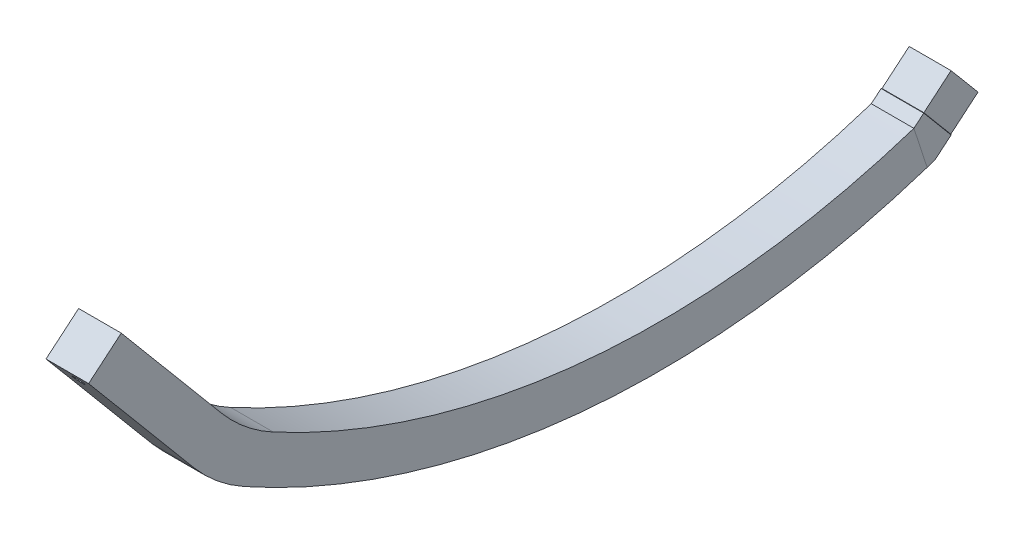
ISO-10303-21;
HEADER;
FILE_DESCRIPTION(('STEP AP214'),'2;1');
FILE_NAME('part.step','',(''),(''),'','','');
FILE_SCHEMA(('AUTOMOTIVE_DESIGN { 1 0 10303 214 1 1 1 1 }'));
ENDSEC;
DATA;
#1=APPLICATION_CONTEXT('core data for automotive mechanical design processes');
#2=APPLICATION_PROTOCOL_DEFINITION('international standard','automotive_design',2000,#1);
#3=PRODUCT_CONTEXT('',#1,'mechanical');
#4=PRODUCT('Part','Part','',(#3));
#5=PRODUCT_RELATED_PRODUCT_CATEGORY('part','',(#4));
#6=PRODUCT_DEFINITION_FORMATION('','',#4);
#7=PRODUCT_DEFINITION_CONTEXT('part definition',#1,'design');
#8=PRODUCT_DEFINITION('design','',#6,#7);
#9=PRODUCT_DEFINITION_SHAPE('','',#8);
#10=(LENGTH_UNIT() NAMED_UNIT(*) SI_UNIT(.MILLI.,.METRE.));
#11=(NAMED_UNIT(*) PLANE_ANGLE_UNIT() SI_UNIT($,.RADIAN.));
#12=(NAMED_UNIT(*) SI_UNIT($,.STERADIAN.) SOLID_ANGLE_UNIT());
#13=UNCERTAINTY_MEASURE_WITH_UNIT(LENGTH_MEASURE(1.E-05),#10,'distance_accuracy_value','');
#14=(GEOMETRIC_REPRESENTATION_CONTEXT(3) GLOBAL_UNCERTAINTY_ASSIGNED_CONTEXT((#13)) GLOBAL_UNIT_ASSIGNED_CONTEXT((#10,
#11,#12)) REPRESENTATION_CONTEXT('',''));
#15=CARTESIAN_POINT('',(0.,0.,0.));
#16=DIRECTION('',(0.,0.,1.));
#17=DIRECTION('',(1.,0.,0.));
#18=AXIS2_PLACEMENT_3D('',#15,#16,#17);
#19=CARTESIAN_POINT('',(12.,23.0257511275811,-14.4824825913771));
#20=DIRECTION('',(0.,0.766044443118982,0.642787609686534));
#21=DIRECTION('',(0.,-0.642787609686534,0.766044443118982));
#22=AXIS2_PLACEMENT_3D('',#19,#20,#21);
#23=PLANE('',#22);
#24=DIRECTION('',(0.,0.642787609686534,-0.766044443118982));
#25=VECTOR('',#24,1.);
#26=CARTESIAN_POINT('',(0.,23.0257511275811,-14.4824825913771));
#27=LINE('',#26,#25);
#28=CARTESIAN_POINT('',(0.,12.7411493725965,-2.22577150147341));
#29=VERTEX_POINT('',#28);
#30=CARTESIAN_POINT('',(0.,16.5335962697471,-6.7454337158754));
#31=VERTEX_POINT('',#30);
#32=EDGE_CURVE('E190',#29,#31,#27,.T.);
#33=ORIENTED_EDGE('',*,*,#32,.T.);
#34=DIRECTION('',(1.,0.,0.));
#35=VECTOR('',#34,1.);
#36=CARTESIAN_POINT('',(12.,16.5335962697471,-6.7454337158754));
#37=LINE('',#36,#35);
#38=CARTESIAN_POINT('',(12.,16.533596269747,-6.74543371587538));
#39=VERTEX_POINT('',#38);
#40=EDGE_CURVE('E69',#31,#39,#37,.T.);
#41=ORIENTED_EDGE('',*,*,#40,.T.);
#42=DIRECTION('',(0.,0.642787609686534,-0.766044443118982));
#43=VECTOR('',#42,1.);
#44=CARTESIAN_POINT('',(12.,23.0257511275811,-14.4824825913771));
#45=LINE('',#44,#43);
#46=CARTESIAN_POINT('',(12.,12.7411493725965,-2.22577150147341));
#47=VERTEX_POINT('',#46);
#48=EDGE_CURVE('E181',#47,#39,#45,.T.);
#49=ORIENTED_EDGE('',*,*,#48,.F.);
#50=DIRECTION('',(-1.,0.,0.));
#51=VECTOR('',#50,1.);
#52=CARTESIAN_POINT('',(12.,12.7411493725965,-2.22577150147341));
#53=LINE('',#52,#51);
#54=EDGE_CURVE('E195',#47,#29,#53,.T.);
#55=ORIENTED_EDGE('',*,*,#54,.T.);
#56=EDGE_LOOP('',(#33,#41,#49,#55));
#57=FACE_BOUND('',#56,.T.);
#58=ADVANCED_FACE('F45',(#57),#23,.F.);
#59=CARTESIAN_POINT('',(12.,23.403668611832,3.73581881138778));
#60=DIRECTION('',(0.,-0.766044443118981,-0.642787609686535));
#61=DIRECTION('',(0.,0.642787609686535,-0.766044443118982));
#62=AXIS2_PLACEMENT_3D('',#59,#60,#61);
#63=PLANE('',#62);
#64=DIRECTION('',(0.,-0.642787609686535,0.766044443118982));
#65=VECTOR('',#64,1.);
#66=CARTESIAN_POINT('',(12.,23.403668611832,3.73581881138778));
#67=LINE('',#66,#65);
#68=CARTESIAN_POINT('',(12.,25.7261295871748,0.968017600363012));
#69=VERTEX_POINT('',#68);
#70=CARTESIAN_POINT('',(12.,23.403668611832,3.73581881138778));
#71=VERTEX_POINT('',#70);
#72=EDGE_CURVE('E183',#69,#71,#67,.T.);
#73=ORIENTED_EDGE('',*,*,#72,.F.);
#74=DIRECTION('',(-1.,0.,0.));
#75=VECTOR('',#74,1.);
#76=CARTESIAN_POINT('',(0.,25.7261295871748,0.968017600363013));
#77=LINE('',#76,#75);
#78=CARTESIAN_POINT('',(0.,25.7261295871748,0.968017600363012));
#79=VERTEX_POINT('',#78);
#80=EDGE_CURVE('E12',#69,#79,#77,.T.);
#81=ORIENTED_EDGE('',*,*,#80,.T.);
#82=DIRECTION('',(0.,-0.642787609686535,0.766044443118982));
#83=VECTOR('',#82,1.);
#84=CARTESIAN_POINT('',(0.,23.403668611832,3.73581881138778));
#85=LINE('',#84,#83);
#86=CARTESIAN_POINT('',(0.,23.403668611832,3.73581881138778));
#87=VERTEX_POINT('',#86);
#88=EDGE_CURVE('E179',#79,#87,#85,.T.);
#89=ORIENTED_EDGE('',*,*,#88,.T.);
#90=DIRECTION('',(-1.,0.,0.));
#91=VECTOR('',#90,1.);
#92=CARTESIAN_POINT('',(12.,23.403668611832,3.73581881138778));
#93=LINE('',#92,#91);
#94=EDGE_CURVE('E185',#71,#87,#93,.T.);
#95=ORIENTED_EDGE('',*,*,#94,.F.);
#96=EDGE_LOOP('',(#73,#81,#89,#95));
#97=FACE_BOUND('',#96,.T.);
#98=ADVANCED_FACE('F213',(#97),#63,.F.);
#99=CARTESIAN_POINT('',(12.,241.476472406345,75.1760290102655));
#100=DIRECTION('',(1.,0.,0.));
#101=DIRECTION('',(0.,0.,-1.));
#102=AXIS2_PLACEMENT_3D('',#99,#100,#101);
#103=PLANE('',#102);
#104=ORIENTED_EDGE('',*,*,#48,.T.);
#105=DIRECTION('',(0.,0.766044443118981,0.642787609686535));
#106=VECTOR('',#105,1.);
#107=CARTESIAN_POINT('',(12.,188.873940413588,137.865285492186));
#108=LINE('',#107,#106);
#109=EDGE_CURVE('E54',#39,#69,#108,.T.);
#110=ORIENTED_EDGE('',*,*,#109,.T.);
#111=ORIENTED_EDGE('',*,*,#72,.T.);
#112=DIRECTION('',(0.,-0.950305717652662,-0.311318234282315));
#113=VECTOR('',#112,1.);
#114=CARTESIAN_POINT('',(12.,23.403668611832,3.73581881138778));
#115=LINE('',#114,#113);
#116=CARTESIAN_POINT('',(12.,12.,1.52655665885959E-13));
#117=VERTEX_POINT('',#116);
#118=EDGE_CURVE('E175',#71,#117,#115,.T.);
#119=ORIENTED_EDGE('',*,*,#118,.T.);
#120=CARTESIAN_POINT('',(12.,241.476472406345,75.1760290102655));
#121=DIRECTION('',(1.,0.,0.));
#122=DIRECTION('',(0.,0.,-1.));
#123=AXIS2_PLACEMENT_3D('',#120,#121,#122);
#124=CIRCLE('',#123,241.476472406345);
#125=EDGE_CURVE('E178',#117,#47,#124,.T.);
#126=ORIENTED_EDGE('',*,*,#125,.T.);
#127=EDGE_LOOP('',(#104,#110,#111,#119,#126));
#128=FACE_BOUND('',#127,.T.);
#129=ADVANCED_FACE('F223',(#128),#103,.T.);
#130=CARTESIAN_POINT('',(0.,241.476472406345,75.1760290102655));
#131=DIRECTION('',(1.,0.,0.));
#132=DIRECTION('',(0.,0.,-1.));
#133=AXIS2_PLACEMENT_3D('',#130,#131,#132);
#134=PLANE('',#133);
#135=ORIENTED_EDGE('',*,*,#88,.F.);
#136=DIRECTION('',(0.,-0.766044443118981,-0.642787609686535));
#137=VECTOR('',#136,1.);
#138=CARTESIAN_POINT('',(0.,16.5335962697471,-6.74543371587538));
#139=LINE('',#138,#137);
#140=EDGE_CURVE('E125',#79,#31,#139,.T.);
#141=ORIENTED_EDGE('',*,*,#140,.T.);
#142=ORIENTED_EDGE('',*,*,#32,.F.);
#143=CARTESIAN_POINT('',(0.,241.476472406345,75.1760290102655));
#144=DIRECTION('',(1.,0.,0.));
#145=DIRECTION('',(0.,0.,-1.));
#146=AXIS2_PLACEMENT_3D('',#143,#144,#145);
#147=CIRCLE('',#146,241.476472406345);
#148=CARTESIAN_POINT('',(0.,12.,1.52655665885959E-13));
#149=VERTEX_POINT('',#148);
#150=EDGE_CURVE('E188',#149,#29,#147,.T.);
#151=ORIENTED_EDGE('',*,*,#150,.F.);
#152=DIRECTION('',(0.,-0.950305717652662,-0.311318234282315));
#153=VECTOR('',#152,1.);
#154=CARTESIAN_POINT('',(0.,23.403668611832,3.73581881138778));
#155=LINE('',#154,#153);
#156=EDGE_CURVE('E171',#87,#149,#155,.T.);
#157=ORIENTED_EDGE('',*,*,#156,.F.);
#158=EDGE_LOOP('',(#135,#141,#142,#151,#157));
#159=FACE_BOUND('',#158,.T.);
#160=ADVANCED_FACE('F217',(#159),#134,.F.);
#161=CARTESIAN_POINT('',(12.,23.403668611832,3.73581881138778));
#162=DIRECTION('',(0.,0.311318234282315,-0.950305717652662));
#163=DIRECTION('',(0.,0.950305717652662,0.311318234282315));
#164=AXIS2_PLACEMENT_3D('',#161,#162,#163);
#165=PLANE('',#164);
#166=ORIENTED_EDGE('',*,*,#156,.T.);
#167=DIRECTION('',(-1.,0.,0.));
#168=VECTOR('',#167,1.);
#169=CARTESIAN_POINT('',(12.,12.,1.52655665885959E-13));
#170=LINE('',#169,#168);
#171=EDGE_CURVE('E198',#117,#149,#170,.T.);
#172=ORIENTED_EDGE('',*,*,#171,.F.);
#173=ORIENTED_EDGE('',*,*,#118,.F.);
#174=ORIENTED_EDGE('',*,*,#94,.T.);
#175=EDGE_LOOP('',(#166,#172,#173,#174));
#176=FACE_BOUND('',#175,.T.);
#177=ADVANCED_FACE('F221',(#176),#165,.F.);
#178=CARTESIAN_POINT('',(12.,241.476472406345,75.1760290102655));
#179=DIRECTION('',(-1.,0.,0.));
#180=DIRECTION('',(0.,0.,1.));
#181=AXIS2_PLACEMENT_3D('',#178,#179,#180);
#182=CYLINDRICAL_SURFACE('',#181,241.476472406345);
#183=ORIENTED_EDGE('',*,*,#150,.T.);
#184=ORIENTED_EDGE('',*,*,#54,.F.);
#185=ORIENTED_EDGE('',*,*,#125,.F.);
#186=ORIENTED_EDGE('',*,*,#171,.T.);
#187=EDGE_LOOP('',(#183,#184,#185,#186));
#188=FACE_BOUND('',#187,.T.);
#189=ADVANCED_FACE('F226',(#188),#182,.T.);
#190=CARTESIAN_POINT('',(0.1,16.6744794750276,-6.75775939921866));
#191=DIRECTION('',(-1.,0.,0.));
#192=DIRECTION('',(0.,0.,1.));
#193=AXIS2_PLACEMENT_3D('',#190,#191,#192);
#194=PLANE('',#193);
#195=DIRECTION('',(0.,0.766044443118982,0.642787609686535));
#196=VECTOR('',#195,1.);
#197=CARTESIAN_POINT('',(0.1,23.102355571893,-14.4182038304085));
#198=LINE('',#197,#196);
#199=CARTESIAN_POINT('',(0.1,23.102355571893,-14.4182038304085));
#200=VERTEX_POINT('',#199);
#201=CARTESIAN_POINT('',(0.1,32.141680000697,-6.83331003610735));
#202=VERTEX_POINT('',#201);
#203=EDGE_CURVE('E165',#200,#202,#198,.T.);
#204=ORIENTED_EDGE('',*,*,#203,.F.);
#205=DIRECTION('',(0.,0.642787609686535,-0.766044443118981));
#206=VECTOR('',#205,1.);
#207=CARTESIAN_POINT('',(0.1,16.6744794750276,-6.75775939921866));
#208=LINE('',#207,#206);
#209=CARTESIAN_POINT('',(0.1,16.6744794750276,-6.75775939921866));
#210=VERTEX_POINT('',#209);
#211=EDGE_CURVE('E154',#210,#200,#208,.T.);
#212=ORIENTED_EDGE('',*,*,#211,.F.);
#213=DIRECTION('',(0.,0.766044443118982,0.642787609686535));
#214=VECTOR('',#213,1.);
#215=CARTESIAN_POINT('',(0.1,16.6744794750276,-6.75775939921866));
#216=LINE('',#215,#214);
#217=CARTESIAN_POINT('',(0.1,25.7138039038316,0.827134395082459));
#218=VERTEX_POINT('',#217);
#219=EDGE_CURVE('E123',#210,#218,#216,.T.);
#220=ORIENTED_EDGE('',*,*,#219,.T.);
#221=DIRECTION('',(0.,0.642787609686535,-0.766044443118981));
#222=VECTOR('',#221,1.);
#223=CARTESIAN_POINT('',(0.1,25.7138039038316,0.827134395082459));
#224=LINE('',#223,#222);
#225=EDGE_CURVE('E143',#218,#202,#224,.T.);
#226=ORIENTED_EDGE('',*,*,#225,.T.);
#227=EDGE_LOOP('',(#204,#212,#220,#226));
#228=FACE_BOUND('',#227,.T.);
#229=ADVANCED_FACE('F153',(#228),#194,.T.);
#230=CARTESIAN_POINT('',(11.9,16.6744794750276,-6.75775939921866));
#231=DIRECTION('',(0.,-0.766044443118981,-0.642787609686535));
#232=DIRECTION('',(0.,0.642787609686535,-0.766044443118981));
#233=AXIS2_PLACEMENT_3D('',#230,#231,#232);
#234=PLANE('',#233);
#235=DIRECTION('',(-1.,0.,0.));
#236=VECTOR('',#235,1.);
#237=CARTESIAN_POINT('',(11.9,23.102355571893,-14.4182038304085));
#238=LINE('',#237,#236);
#239=CARTESIAN_POINT('',(11.9,23.102355571893,-14.4182038304085));
#240=VERTEX_POINT('',#239);
#241=EDGE_CURVE('E156',#240,#200,#238,.T.);
#242=ORIENTED_EDGE('',*,*,#241,.F.);
#243=DIRECTION('',(0.,0.642787609686535,-0.766044443118981));
#244=VECTOR('',#243,1.);
#245=CARTESIAN_POINT('',(11.9,16.6744794750276,-6.75775939921866));
#246=LINE('',#245,#244);
#247=CARTESIAN_POINT('',(11.9,16.6744794750276,-6.75775939921866));
#248=VERTEX_POINT('',#247);
#249=EDGE_CURVE('E172',#248,#240,#246,.T.);
#250=ORIENTED_EDGE('',*,*,#249,.F.);
#251=DIRECTION('',(-1.,0.,0.));
#252=VECTOR('',#251,1.);
#253=CARTESIAN_POINT('',(11.9,16.6744794750276,-6.75775939921866));
#254=LINE('',#253,#252);
#255=EDGE_CURVE('E151',#248,#210,#254,.T.);
#256=ORIENTED_EDGE('',*,*,#255,.T.);
#257=ORIENTED_EDGE('',*,*,#211,.T.);
#258=EDGE_LOOP('',(#242,#250,#256,#257));
#259=FACE_BOUND('',#258,.T.);
#260=ADVANCED_FACE('F258',(#259),#234,.T.);
#261=CARTESIAN_POINT('',(11.9,16.6744794750276,-6.75775939921866));
#262=DIRECTION('',(1.,0.,0.));
#263=DIRECTION('',(0.,0.,-1.));
#264=AXIS2_PLACEMENT_3D('',#261,#262,#263);
#265=PLANE('',#264);
#266=DIRECTION('',(0.,-0.766044443118982,-0.642787609686535));
#267=VECTOR('',#266,1.);
#268=CARTESIAN_POINT('',(11.9,23.102355571893,-14.4182038304085));
#269=LINE('',#268,#267);
#270=CARTESIAN_POINT('',(11.9,32.141680000697,-6.83331003610735));
#271=VERTEX_POINT('',#270);
#272=EDGE_CURVE('E159',#271,#240,#269,.T.);
#273=ORIENTED_EDGE('',*,*,#272,.F.);
#274=DIRECTION('',(0.,0.642787609686535,-0.766044443118981));
#275=VECTOR('',#274,1.);
#276=CARTESIAN_POINT('',(11.9,25.7138039038316,0.827134395082459));
#277=LINE('',#276,#275);
#278=CARTESIAN_POINT('',(11.9,25.7138039038316,0.82713439508246));
#279=VERTEX_POINT('',#278);
#280=EDGE_CURVE('E150',#279,#271,#277,.T.);
#281=ORIENTED_EDGE('',*,*,#280,.F.);
#282=DIRECTION('',(0.,-0.766044443118982,-0.642787609686535));
#283=VECTOR('',#282,1.);
#284=CARTESIAN_POINT('',(11.9,16.6744794750276,-6.75775939921866));
#285=LINE('',#284,#283);
#286=EDGE_CURVE('E140',#279,#248,#285,.T.);
#287=ORIENTED_EDGE('',*,*,#286,.T.);
#288=ORIENTED_EDGE('',*,*,#249,.T.);
#289=EDGE_LOOP('',(#273,#281,#287,#288));
#290=FACE_BOUND('',#289,.T.);
#291=ADVANCED_FACE('F254',(#290),#265,.T.);
#292=CARTESIAN_POINT('',(11.9,25.7138039038316,0.827134395082459));
#293=DIRECTION('',(0.,0.766044443118981,0.642787609686535));
#294=DIRECTION('',(0.,-0.642787609686535,0.766044443118981));
#295=AXIS2_PLACEMENT_3D('',#292,#293,#294);
#296=PLANE('',#295);
#297=DIRECTION('',(1.,0.,0.));
#298=VECTOR('',#297,1.);
#299=CARTESIAN_POINT('',(11.9,32.141680000697,-6.83331003610736));
#300=LINE('',#299,#298);
#301=EDGE_CURVE('E146',#202,#271,#300,.T.);
#302=ORIENTED_EDGE('',*,*,#301,.F.);
#303=ORIENTED_EDGE('',*,*,#225,.F.);
#304=DIRECTION('',(1.,0.,0.));
#305=VECTOR('',#304,1.);
#306=CARTESIAN_POINT('',(11.9,25.7138039038316,0.827134395082459));
#307=LINE('',#306,#305);
#308=EDGE_CURVE('E132',#218,#279,#307,.T.);
#309=ORIENTED_EDGE('',*,*,#308,.T.);
#310=ORIENTED_EDGE('',*,*,#280,.T.);
#311=EDGE_LOOP('',(#302,#303,#309,#310));
#312=FACE_BOUND('',#311,.T.);
#313=ADVANCED_FACE('F144',(#312),#296,.T.);
#314=CARTESIAN_POINT('',(12.,32.2182844450088,-6.7690312751387));
#315=DIRECTION('',(0.,-0.642787609686535,0.766044443118981));
#316=DIRECTION('',(0.,-0.766044443118981,-0.642787609686535));
#317=AXIS2_PLACEMENT_3D('',#314,#315,#316);
#318=PLANE('',#317);
#319=ORIENTED_EDGE('',*,*,#203,.T.);
#320=ORIENTED_EDGE('',*,*,#301,.T.);
#321=ORIENTED_EDGE('',*,*,#272,.T.);
#322=ORIENTED_EDGE('',*,*,#241,.T.);
#323=EDGE_LOOP('',(#319,#320,#321,#322));
#324=FACE_BOUND('',#323,.T.);
#325=ADVANCED_FACE('F235',(#324),#318,.F.);
#326=CARTESIAN_POINT('',(12.,188.873940413588,137.865285492186));
#327=DIRECTION('',(-0.707106781186633,-0.454519477671986,0.541675220419639));
#328=DIRECTION('',(0.,0.766044443118981,0.642787609686535));
#329=AXIS2_PLACEMENT_3D('',#326,#327,#328);
#330=PLANE('',#329);
#331=DIRECTION('',(0.577350269189527,0.0711623659617004,0.813389564930307));
#332=VECTOR('',#331,1.);
#333=CARTESIAN_POINT('',(9.93333333333398,25.4713987980811,-1.94356864210147));
#334=LINE('',#333,#332);
#335=EDGE_CURVE('E136',#69,#279,#334,.F.);
#336=ORIENTED_EDGE('',*,*,#335,.F.);
#337=ORIENTED_EDGE('',*,*,#109,.F.);
#338=DIRECTION('',(0.577350269189526,-0.81338956493031,0.0711623659616761));
#339=VECTOR('',#338,1.);
#340=CARTESIAN_POINT('',(-62.9914471637958,122.183950720401,-15.9886420278021));
#341=LINE('',#340,#339);
#342=EDGE_CURVE('E49',#248,#39,#341,.T.);
#343=ORIENTED_EDGE('',*,*,#342,.F.);
#344=ORIENTED_EDGE('',*,*,#286,.F.);
#345=EDGE_LOOP('',(#336,#337,#343,#344));
#346=FACE_BOUND('',#345,.T.);
#347=ADVANCED_FACE('F47',(#346),#330,.F.);
#348=CARTESIAN_POINT('',(6.,16.6744794750276,-6.75775939921864));
#349=DIRECTION('',(0.,-0.0871557427476467,-0.996194698091746));
#350=DIRECTION('',(1.,0.,0.));
#351=AXIS2_PLACEMENT_3D('',#348,#349,#350);
#352=PLANE('',#351);
#353=ORIENTED_EDGE('',*,*,#342,.T.);
#354=ORIENTED_EDGE('',*,*,#40,.F.);
#355=DIRECTION('',(0.577350269189529,0.813389564930307,-0.0711623659616759));
#356=VECTOR('',#355,1.);
#357=CARTESIAN_POINT('',(2.06666666666601,19.4451825122116,-7.00016450496905));
#358=LINE('',#357,#356);
#359=EDGE_CURVE('E128',#210,#31,#358,.F.);
#360=ORIENTED_EDGE('',*,*,#359,.F.);
#361=ORIENTED_EDGE('',*,*,#255,.F.);
#362=EDGE_LOOP('',(#353,#354,#360,#361));
#363=FACE_BOUND('',#362,.T.);
#364=ADVANCED_FACE('F208',(#363),#352,.T.);
#365=CARTESIAN_POINT('',(6.,25.7138039038316,0.827134395082455));
#366=DIRECTION('',(0.,0.996194698091744,-0.0871557427476766));
#367=DIRECTION('',(-1.,0.,0.));
#368=AXIS2_PLACEMENT_3D('',#365,#366,#367);
#369=PLANE('',#368);
#370=ORIENTED_EDGE('',*,*,#335,.T.);
#371=ORIENTED_EDGE('',*,*,#308,.F.);
#372=DIRECTION('',(-0.57735026918953,0.0711623659617003,0.813389564930304));
#373=VECTOR('',#372,1.);
#374=CARTESIAN_POINT('',(2.06666666666602,25.4713987980811,-1.94356864210149));
#375=LINE('',#374,#373);
#376=EDGE_CURVE('E119',#79,#218,#375,.F.);
#377=ORIENTED_EDGE('',*,*,#376,.F.);
#378=ORIENTED_EDGE('',*,*,#80,.F.);
#379=EDGE_LOOP('',(#370,#371,#377,#378));
#380=FACE_BOUND('',#379,.T.);
#381=ADVANCED_FACE('F134',(#380),#369,.T.);
#382=CARTESIAN_POINT('',(0.100000000000007,21.1941416894296,-2.9653125020681));
#383=DIRECTION('',(-0.70710678118663,0.454519477671988,-0.541675220419641));
#384=DIRECTION('',(0.,-0.766044443118981,-0.642787609686535));
#385=AXIS2_PLACEMENT_3D('',#382,#383,#384);
#386=PLANE('',#385);
#387=ORIENTED_EDGE('',*,*,#359,.T.);
#388=ORIENTED_EDGE('',*,*,#140,.F.);
#389=ORIENTED_EDGE('',*,*,#376,.T.);
#390=ORIENTED_EDGE('',*,*,#219,.F.);
#391=EDGE_LOOP('',(#387,#388,#389,#390));
#392=FACE_BOUND('',#391,.T.);
#393=ADVANCED_FACE('F121',(#392),#386,.T.);
#394=CLOSED_SHELL('',(#58,#98,#129,#160,#177,#189,#229,#260,#291,#313,#325,#347,#364,#381,#393));
#395=MANIFOLD_SOLID_BREP('B2',#394);
#396=CARTESIAN_POINT('',(12.,241.476472406345,75.1760290102655));
#397=DIRECTION('',(-1.,0.,0.));
#398=DIRECTION('',(0.,0.,1.));
#399=AXIS2_PLACEMENT_3D('',#396,#397,#398);
#400=CYLINDRICAL_SURFACE('',#399,241.476472406345);
#401=CARTESIAN_POINT('',(12.,241.476472406345,75.1760290102655));
#402=DIRECTION('',(1.,0.,0.));
#403=DIRECTION('',(0.,0.,1.));
#404=AXIS2_PLACEMENT_3D('',#401,#402,#403);
#405=CIRCLE('',#404,241.476472406345);
#406=CARTESIAN_POINT('',(12.,30.3736096091177,192.421361730282));
#407=VERTEX_POINT('',#406);
#408=CARTESIAN_POINT('',(12.,12.,0.));
#409=VERTEX_POINT('',#408);
#410=EDGE_CURVE('E450',#407,#409,#405,.T.);
#411=ORIENTED_EDGE('',*,*,#410,.F.);
#412=DIRECTION('',(-1.,0.,0.));
#413=VECTOR('',#412,1.);
#414=CARTESIAN_POINT('',(12.,30.3736096091177,192.421361730282));
#415=LINE('',#414,#413);
#416=CARTESIAN_POINT('',(0.,30.3736096091177,192.421361730282));
#417=VERTEX_POINT('',#416);
#418=EDGE_CURVE('E471',#407,#417,#415,.T.);
#419=ORIENTED_EDGE('',*,*,#418,.T.);
#420=CARTESIAN_POINT('',(0.,241.476472406345,75.1760290102655));
#421=DIRECTION('',(1.,0.,0.));
#422=DIRECTION('',(0.,0.,1.));
#423=AXIS2_PLACEMENT_3D('',#420,#421,#422);
#424=CIRCLE('',#423,241.476472406345);
#425=CARTESIAN_POINT('',(0.,12.,0.));
#426=VERTEX_POINT('',#425);
#427=EDGE_CURVE('E449',#417,#426,#424,.T.);
#428=ORIENTED_EDGE('',*,*,#427,.T.);
#429=DIRECTION('',(-1.,0.,0.));
#430=VECTOR('',#429,1.);
#431=CARTESIAN_POINT('',(12.,12.,0.));
#432=LINE('',#431,#430);
#433=EDGE_CURVE('E465',#409,#426,#432,.T.);
#434=ORIENTED_EDGE('',*,*,#433,.F.);
#435=EDGE_LOOP('',(#411,#419,#428,#434));
#436=FACE_BOUND('',#435,.T.);
#437=ADVANCED_FACE('F355',(#436),#400,.T.);
#438=CARTESIAN_POINT('',(12.,12.,0.));
#439=DIRECTION('',(0.,-0.311318234282315,0.950305717652662));
#440=DIRECTION('',(0.,-0.950305717652662,-0.311318234282315));
#441=AXIS2_PLACEMENT_3D('',#438,#439,#440);
#442=PLANE('',#441);
#443=DIRECTION('',(0.,0.950305717652662,0.311318234282315));
#444=VECTOR('',#443,1.);
#445=CARTESIAN_POINT('',(0.,12.,0.));
#446=LINE('',#445,#444);
#447=CARTESIAN_POINT('',(0.,23.403668611832,3.73581881138778));
#448=VERTEX_POINT('',#447);
#449=EDGE_CURVE('E459',#426,#448,#446,.T.);
#450=ORIENTED_EDGE('',*,*,#449,.T.);
#451=DIRECTION('',(-1.,0.,0.));
#452=VECTOR('',#451,1.);
#453=CARTESIAN_POINT('',(12.,23.403668611832,3.73581881138778));
#454=LINE('',#453,#452);
#455=CARTESIAN_POINT('',(12.,23.403668611832,3.73581881138778));
#456=VERTEX_POINT('',#455);
#457=EDGE_CURVE('E457',#456,#448,#454,.T.);
#458=ORIENTED_EDGE('',*,*,#457,.F.);
#459=DIRECTION('',(0.,0.950305717652662,0.311318234282315));
#460=VECTOR('',#459,1.);
#461=CARTESIAN_POINT('',(12.,12.,0.));
#462=LINE('',#461,#460);
#463=EDGE_CURVE('E452',#409,#456,#462,.T.);
#464=ORIENTED_EDGE('',*,*,#463,.F.);
#465=ORIENTED_EDGE('',*,*,#433,.T.);
#466=EDGE_LOOP('',(#450,#458,#464,#465));
#467=FACE_BOUND('',#466,.T.);
#468=ADVANCED_FACE('F497',(#467),#442,.F.);
#469=CARTESIAN_POINT('',(12.,241.476472406345,75.1760290102655));
#470=DIRECTION('',(-1.,0.,0.));
#471=DIRECTION('',(0.,0.,1.));
#472=AXIS2_PLACEMENT_3D('',#469,#470,#471);
#473=CYLINDRICAL_SURFACE('',#472,229.476472406345);
#474=CARTESIAN_POINT('',(0.,241.476472406345,75.1760290102655));
#475=DIRECTION('',(-1.,0.,0.));
#476=DIRECTION('',(0.,0.,1.));
#477=AXIS2_PLACEMENT_3D('',#474,#475,#476);
#478=CIRCLE('',#477,229.476472406345);
#479=CARTESIAN_POINT('',(0.,39.5231160556017,184.145259744128));
#480=VERTEX_POINT('',#479);
#481=EDGE_CURVE('E453',#448,#480,#478,.T.);
#482=ORIENTED_EDGE('',*,*,#481,.T.);
#483=DIRECTION('',(-1.,0.,0.));
#484=VECTOR('',#483,1.);
#485=CARTESIAN_POINT('',(12.,39.5231160556017,184.145259744128));
#486=LINE('',#485,#484);
#487=CARTESIAN_POINT('',(12.,39.5231160556017,184.145259744128));
#488=VERTEX_POINT('',#487);
#489=EDGE_CURVE('E480',#480,#488,#486,.F.);
#490=ORIENTED_EDGE('',*,*,#489,.T.);
#491=CARTESIAN_POINT('',(12.,241.476472406345,75.1760290102655));
#492=DIRECTION('',(-1.,0.,0.));
#493=DIRECTION('',(0.,0.,1.));
#494=AXIS2_PLACEMENT_3D('',#491,#492,#493);
#495=CIRCLE('',#494,229.476472406345);
#496=EDGE_CURVE('E455',#456,#488,#495,.T.);
#497=ORIENTED_EDGE('',*,*,#496,.F.);
#498=ORIENTED_EDGE('',*,*,#457,.T.);
#499=EDGE_LOOP('',(#482,#490,#497,#498));
#500=FACE_BOUND('',#499,.T.);
#501=ADVANCED_FACE('F491',(#500),#473,.F.);
#502=CARTESIAN_POINT('',(12.,241.476472406345,75.1760290102655));
#503=DIRECTION('',(-1.,0.,0.));
#504=DIRECTION('',(0.,0.,1.));
#505=AXIS2_PLACEMENT_3D('',#502,#503,#504);
#506=PLANE('',#505);
#507=DIRECTION('',(0.,0.766044443118982,0.642787609686535));
#508=VECTOR('',#507,1.);
#509=CARTESIAN_POINT('',(12.,71.9959787813234,231.662517153645));
#510=LINE('',#509,#508);
#511=CARTESIAN_POINT('',(12.,41.9450844088605,206.446822769164));
#512=VERTEX_POINT('',#511);
#513=CARTESIAN_POINT('',(12.,77.3582898831563,236.162030421451));
#514=VERTEX_POINT('',#513);
#515=EDGE_CURVE('E425',#512,#514,#510,.T.);
#516=ORIENTED_EDGE('',*,*,#515,.F.);
#517=CARTESIAN_POINT('',(12.,74.0844648931873,168.144600613215));
#518=DIRECTION('',(-1.,0.,0.));
#519=DIRECTION('',(0.,0.,1.));
#520=AXIS2_PLACEMENT_3D('',#517,#518,#519);
#521=CIRCLE('',#520,50.);
#522=EDGE_CURVE('E478',#512,#407,#521,.F.);
#523=ORIENTED_EDGE('',*,*,#522,.T.);
#524=ORIENTED_EDGE('',*,*,#410,.T.);
#525=ORIENTED_EDGE('',*,*,#463,.T.);
#526=ORIENTED_EDGE('',*,*,#496,.T.);
#527=CARTESIAN_POINT('',(12.,83.5261796884465,160.402252543611));
#528=DIRECTION('',(-1.,0.,0.));
#529=DIRECTION('',(0.,0.,1.));
#530=AXIS2_PLACEMENT_3D('',#527,#528,#529);
#531=CIRCLE('',#530,50.);
#532=CARTESIAN_POINT('',(12.,51.3867992041199,198.70447469956));
#533=VERTEX_POINT('',#532);
#534=EDGE_CURVE('E364',#488,#533,#531,.T.);
#535=ORIENTED_EDGE('',*,*,#534,.T.);
#536=DIRECTION('',(0.,0.766044443118982,0.642787609686534));
#537=VECTOR('',#536,1.);
#538=CARTESIAN_POINT('',(12.,79.7094300975618,222.469983836217));
#539=LINE('',#538,#537);
#540=CARTESIAN_POINT('',(12.,85.0717411993947,226.969497104023));
#541=VERTEX_POINT('',#540);
#542=EDGE_CURVE('E417',#533,#541,#539,.T.);
#543=ORIENTED_EDGE('',*,*,#542,.T.);
#544=DIRECTION('',(0.,0.642787609686532,-0.766044443118984));
#545=VECTOR('',#544,1.);
#546=CARTESIAN_POINT('',(12.,77.3582898831563,236.162030421451));
#547=LINE('',#546,#545);
#548=EDGE_CURVE('E422',#514,#541,#547,.T.);
#549=ORIENTED_EDGE('',*,*,#548,.F.);
#550=EDGE_LOOP('',(#516,#523,#524,#525,#526,#535,#543,#549));
#551=FACE_BOUND('',#550,.T.);
#552=ADVANCED_FACE('F420',(#551),#506,.F.);
#553=CARTESIAN_POINT('',(0.,241.476472406345,75.1760290102655));
#554=DIRECTION('',(-1.,0.,0.));
#555=DIRECTION('',(0.,0.,1.));
#556=AXIS2_PLACEMENT_3D('',#553,#554,#555);
#557=PLANE('',#556);
#558=ORIENTED_EDGE('',*,*,#427,.F.);
#559=CARTESIAN_POINT('',(0.,74.0844648931873,168.144600613215));
#560=DIRECTION('',(-1.,0.,0.));
#561=DIRECTION('',(0.,0.,1.));
#562=AXIS2_PLACEMENT_3D('',#559,#560,#561);
#563=CIRCLE('',#562,50.);
#564=CARTESIAN_POINT('',(0.,41.9450844088605,206.446822769164));
#565=VERTEX_POINT('',#564);
#566=EDGE_CURVE('E474',#417,#565,#563,.T.);
#567=ORIENTED_EDGE('',*,*,#566,.T.);
#568=DIRECTION('',(0.,-0.766044443118982,-0.642787609686535));
#569=VECTOR('',#568,1.);
#570=CARTESIAN_POINT('',(0.,94.3966616452473,250.458921882882));
#571=LINE('',#570,#569);
#572=CARTESIAN_POINT('',(0.,77.3582898831563,236.162030421451));
#573=VERTEX_POINT('',#572);
#574=EDGE_CURVE('E468',#573,#565,#571,.T.);
#575=ORIENTED_EDGE('',*,*,#574,.F.);
#576=DIRECTION('',(0.,-0.642787609686532,0.766044443118984));
#577=VECTOR('',#576,1.);
#578=CARTESIAN_POINT('',(0.,77.3582898831563,236.162030421451));
#579=LINE('',#578,#577);
#580=CARTESIAN_POINT('',(0.,85.0717411993947,226.969497104023));
#581=VERTEX_POINT('',#580);
#582=EDGE_CURVE('E434',#581,#573,#579,.T.);
#583=ORIENTED_EDGE('',*,*,#582,.F.);
#584=DIRECTION('',(0.,0.766044443118982,0.642787609686534));
#585=VECTOR('',#584,1.);
#586=CARTESIAN_POINT('',(0.,79.7094300975618,222.469983836217));
#587=LINE('',#586,#585);
#588=CARTESIAN_POINT('',(0.,51.3867992041198,198.70447469956));
#589=VERTEX_POINT('',#588);
#590=EDGE_CURVE('E424',#589,#581,#587,.T.);
#591=ORIENTED_EDGE('',*,*,#590,.F.);
#592=CARTESIAN_POINT('',(0.,83.5261796884465,160.402252543611));
#593=DIRECTION('',(-1.,0.,0.));
#594=DIRECTION('',(0.,0.,1.));
#595=AXIS2_PLACEMENT_3D('',#592,#593,#594);
#596=CIRCLE('',#595,50.);
#597=EDGE_CURVE('E43',#589,#480,#596,.F.);
#598=ORIENTED_EDGE('',*,*,#597,.T.);
#599=ORIENTED_EDGE('',*,*,#481,.F.);
#600=ORIENTED_EDGE('',*,*,#449,.F.);
#601=EDGE_LOOP('',(#558,#567,#575,#583,#591,#598,#599,#600));
#602=FACE_BOUND('',#601,.T.);
#603=ADVANCED_FACE('F487',(#602),#557,.T.);
#604=CARTESIAN_POINT('',(-52.3125128274926,79.7094300975618,222.469983836217));
#605=DIRECTION('',(0.,0.642787609686534,-0.766044443118982));
#606=DIRECTION('',(0.,0.766044443118982,0.642787609686534));
#607=AXIS2_PLACEMENT_3D('',#604,#605,#606);
#608=PLANE('',#607);
#609=CARTESIAN_POINT('',(6.,81.2415189838,223.75555905559));
#610=DIRECTION('',(0.,0.642787609686533,-0.766044443118984));
#611=DIRECTION('',(0.,0.766044443118984,0.642787609686533));
#612=AXIS2_PLACEMENT_3D('',#609,#610,#611);
#613=CIRCLE('',#612,1.55);
#614=CARTESIAN_POINT('',(6.,82.4288878706344,224.751879850604));
#615=VERTEX_POINT('',#614);
#616=EDGE_CURVE('E442',#615,#615,#613,.T.);
#617=ORIENTED_EDGE('',*,*,#616,.F.);
#618=EDGE_LOOP('',(#617));
#619=FACE_BOUND('',#618,.T.);
#620=ORIENTED_EDGE('',*,*,#542,.F.);
#621=DIRECTION('',(-1.,0.,0.));
#622=VECTOR('',#621,1.);
#623=CARTESIAN_POINT('',(-52.3125128274926,51.3867992041198,198.70447469956));
#624=LINE('',#623,#622);
#625=EDGE_CURVE('E482',#533,#589,#624,.T.);
#626=ORIENTED_EDGE('',*,*,#625,.T.);
#627=ORIENTED_EDGE('',*,*,#590,.T.);
#628=DIRECTION('',(-1.,0.,0.));
#629=VECTOR('',#628,1.);
#630=CARTESIAN_POINT('',(0.,85.0717411993947,226.969497104023));
#631=LINE('',#630,#629);
#632=EDGE_CURVE('E428',#541,#581,#631,.T.);
#633=ORIENTED_EDGE('',*,*,#632,.F.);
#634=EDGE_LOOP('',(#620,#626,#627,#633));
#635=FACE_BOUND('',#634,.T.);
#636=ADVANCED_FACE('F429',(#619,#635),#608,.T.);
#637=CARTESIAN_POINT('',(0.,71.9959787813234,231.662517153645));
#638=DIRECTION('',(0.,0.642787609686535,-0.766044443118982));
#639=DIRECTION('',(0.,0.766044443118982,0.642787609686535));
#640=AXIS2_PLACEMENT_3D('',#637,#638,#639);
#641=PLANE('',#640);
#642=CARTESIAN_POINT('',(6.,73.5280676675614,232.948092373018));
#643=DIRECTION('',(0.,0.642787609686535,-0.766044443118982));
#644=DIRECTION('',(0.,0.766044443118982,0.642787609686535));
#645=AXIS2_PLACEMENT_3D('',#642,#643,#644);
#646=CIRCLE('',#645,1.55);
#647=CARTESIAN_POINT('',(6.,74.7154365543958,233.944413168032));
#648=VERTEX_POINT('',#647);
#649=EDGE_CURVE('E359',#648,#648,#646,.T.);
#650=ORIENTED_EDGE('',*,*,#649,.T.);
#651=EDGE_LOOP('',(#650));
#652=FACE_BOUND('',#651,.T.);
#653=ORIENTED_EDGE('',*,*,#574,.T.);
#654=DIRECTION('',(-1.,0.,0.));
#655=VECTOR('',#654,1.);
#656=CARTESIAN_POINT('',(0.,41.9450844088605,206.446822769164));
#657=LINE('',#656,#655);
#658=EDGE_CURVE('E476',#565,#512,#657,.F.);
#659=ORIENTED_EDGE('',*,*,#658,.T.);
#660=ORIENTED_EDGE('',*,*,#515,.T.);
#661=DIRECTION('',(1.,0.,0.));
#662=VECTOR('',#661,1.);
#663=CARTESIAN_POINT('',(0.,77.3582898831563,236.162030421451));
#664=LINE('',#663,#662);
#665=EDGE_CURVE('E439',#573,#514,#664,.T.);
#666=ORIENTED_EDGE('',*,*,#665,.F.);
#667=EDGE_LOOP('',(#653,#659,#660,#666));
#668=FACE_BOUND('',#667,.T.);
#669=ADVANCED_FACE('F506',(#652,#668),#641,.F.);
#670=CARTESIAN_POINT('',(12.,74.0844648931873,168.144600613215));
#671=DIRECTION('',(-1.,0.,0.));
#672=DIRECTION('',(0.,0.,1.));
#673=AXIS2_PLACEMENT_3D('',#670,#671,#672);
#674=CYLINDRICAL_SURFACE('',#673,50.);
#675=ORIENTED_EDGE('',*,*,#522,.F.);
#676=ORIENTED_EDGE('',*,*,#658,.F.);
#677=ORIENTED_EDGE('',*,*,#566,.F.);
#678=ORIENTED_EDGE('',*,*,#418,.F.);
#679=EDGE_LOOP('',(#675,#676,#677,#678));
#680=FACE_BOUND('',#679,.T.);
#681=ADVANCED_FACE('F503',(#680),#674,.T.);
#682=CARTESIAN_POINT('',(12.,83.5261796884465,160.402252543611));
#683=DIRECTION('',(-1.,0.,0.));
#684=DIRECTION('',(0.,0.,1.));
#685=AXIS2_PLACEMENT_3D('',#682,#683,#684);
#686=CYLINDRICAL_SURFACE('',#685,50.);
#687=ORIENTED_EDGE('',*,*,#597,.F.);
#688=ORIENTED_EDGE('',*,*,#625,.F.);
#689=ORIENTED_EDGE('',*,*,#534,.F.);
#690=ORIENTED_EDGE('',*,*,#489,.F.);
#691=EDGE_LOOP('',(#687,#688,#689,#690));
#692=FACE_BOUND('',#691,.T.);
#693=ADVANCED_FACE('F357',(#692),#686,.F.);
#694=CARTESIAN_POINT('',(0.,161.682807237473,135.667983920669));
#695=DIRECTION('',(0.,-0.766044443118984,-0.642787609686532));
#696=DIRECTION('',(0.,0.642787609686532,-0.766044443118984));
#697=AXIS2_PLACEMENT_3D('',#694,#695,#696);
#698=PLANE('',#697);
#699=ORIENTED_EDGE('',*,*,#548,.T.);
#700=ORIENTED_EDGE('',*,*,#632,.T.);
#701=ORIENTED_EDGE('',*,*,#582,.T.);
#702=ORIENTED_EDGE('',*,*,#665,.T.);
#703=EDGE_LOOP('',(#699,#700,#701,#702));
#704=FACE_BOUND('',#703,.T.);
#705=ADVANCED_FACE('F437',(#704),#698,.F.);
#706=CARTESIAN_POINT('',(6.,41.565485758804,271.039614191367));
#707=DIRECTION('',(0.,0.642787609686533,-0.766044443118983));
#708=DIRECTION('',(0.,0.766044443118983,0.642787609686533));
#709=AXIS2_PLACEMENT_3D('',#706,#707,#708);
#710=CYLINDRICAL_SURFACE('',#709,1.55);
#711=ORIENTED_EDGE('',*,*,#616,.T.);
#712=EDGE_LOOP('',(#711));
#713=FACE_BOUND('',#712,.T.);
#714=ORIENTED_EDGE('',*,*,#649,.F.);
#715=EDGE_LOOP('',(#714));
#716=FACE_BOUND('',#715,.T.);
#717=ADVANCED_FACE('F557',(#713,#716),#710,.F.);
#718=CLOSED_SHELL('',(#437,#468,#501,#552,#603,#636,#669,#681,#693,#705,#717));
#719=MANIFOLD_SOLID_BREP('B6',#718);
#720=ADVANCED_BREP_SHAPE_REPRESENTATION('',(#18,#395,#719),#14);
#721=SHAPE_DEFINITION_REPRESENTATION(#9,#720);
ENDSEC;
END-ISO-10303-21;
